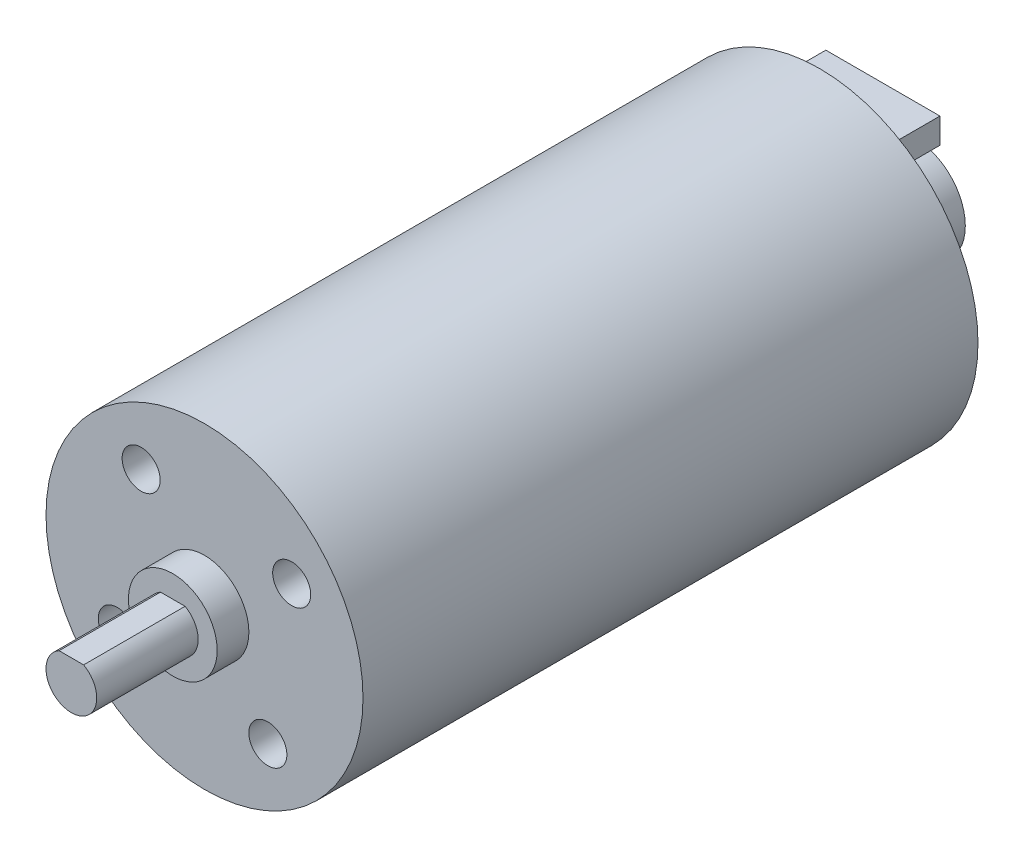
ISO-10303-21;
HEADER;
FILE_DESCRIPTION(('STEP AP214'),'2;1');
FILE_NAME('part.step','',(''),(''),'','','');
FILE_SCHEMA(('AUTOMOTIVE_DESIGN { 1 0 10303 214 1 1 1 1 }'));
ENDSEC;
DATA;
#1=APPLICATION_CONTEXT('core data for automotive mechanical design processes');
#2=APPLICATION_PROTOCOL_DEFINITION('international standard','automotive_design',2000,#1);
#3=PRODUCT_CONTEXT('',#1,'mechanical');
#4=PRODUCT('Part','Part','',(#3));
#5=PRODUCT_RELATED_PRODUCT_CATEGORY('part','',(#4));
#6=PRODUCT_DEFINITION_FORMATION('','',#4);
#7=PRODUCT_DEFINITION_CONTEXT('part definition',#1,'design');
#8=PRODUCT_DEFINITION('design','',#6,#7);
#9=PRODUCT_DEFINITION_SHAPE('','',#8);
#10=(LENGTH_UNIT() NAMED_UNIT(*) SI_UNIT(.MILLI.,.METRE.));
#11=(NAMED_UNIT(*) PLANE_ANGLE_UNIT() SI_UNIT($,.RADIAN.));
#12=(NAMED_UNIT(*) SI_UNIT($,.STERADIAN.) SOLID_ANGLE_UNIT());
#13=UNCERTAINTY_MEASURE_WITH_UNIT(LENGTH_MEASURE(1.E-05),#10,'distance_accuracy_value','');
#14=(GEOMETRIC_REPRESENTATION_CONTEXT(3) GLOBAL_UNCERTAINTY_ASSIGNED_CONTEXT((#13)) GLOBAL_UNIT_ASSIGNED_CONTEXT((#10,
#11,#12)) REPRESENTATION_CONTEXT('',''));
#15=CARTESIAN_POINT('',(0.,0.,0.));
#16=DIRECTION('',(0.,0.,1.));
#17=DIRECTION('',(1.,0.,0.));
#18=AXIS2_PLACEMENT_3D('',#15,#16,#17);
#19=CARTESIAN_POINT('',(0.,0.,0.));
#20=DIRECTION('',(0.,0.,1.));
#21=DIRECTION('',(1.,0.,0.));
#22=AXIS2_PLACEMENT_3D('',#19,#20,#21);
#23=PLANE('',#22);
#24=DIRECTION('',(0.,1.,0.));
#25=VECTOR('',#24,1.);
#26=CARTESIAN_POINT('',(-4.5,-7.,0.));
#27=LINE('',#26,#25);
#28=CARTESIAN_POINT('',(-4.5,-9.,0.));
#29=VERTEX_POINT('',#28);
#30=CARTESIAN_POINT('',(-4.5,-7.,0.));
#31=VERTEX_POINT('',#30);
#32=EDGE_CURVE('E133',#29,#31,#27,.T.);
#33=ORIENTED_EDGE('',*,*,#32,.F.);
#34=DIRECTION('',(-1.,0.,0.));
#35=VECTOR('',#34,1.);
#36=CARTESIAN_POINT('',(-4.5,-9.,0.));
#37=LINE('',#36,#35);
#38=CARTESIAN_POINT('',(4.5,-9.,0.));
#39=VERTEX_POINT('',#38);
#40=EDGE_CURVE('E146',#39,#29,#37,.T.);
#41=ORIENTED_EDGE('',*,*,#40,.F.);
#42=DIRECTION('',(0.,-1.,0.));
#43=VECTOR('',#42,1.);
#44=CARTESIAN_POINT('',(4.5,-7.,0.));
#45=LINE('',#44,#43);
#46=CARTESIAN_POINT('',(4.5,-7.,0.));
#47=VERTEX_POINT('',#46);
#48=EDGE_CURVE('E155',#47,#39,#45,.T.);
#49=ORIENTED_EDGE('',*,*,#48,.F.);
#50=DIRECTION('',(1.,0.,0.));
#51=VECTOR('',#50,1.);
#52=CARTESIAN_POINT('',(-4.5,-7.,0.));
#53=LINE('',#52,#51);
#54=EDGE_CURVE('E136',#31,#47,#53,.T.);
#55=ORIENTED_EDGE('',*,*,#54,.F.);
#56=EDGE_LOOP('',(#33,#41,#49,#55));
#57=FACE_BOUND('',#56,.T.);
#58=CARTESIAN_POINT('',(0.,0.,0.));
#59=DIRECTION('',(0.,0.,1.));
#60=DIRECTION('',(1.,0.,0.));
#61=AXIS2_PLACEMENT_3D('',#58,#59,#60);
#62=CIRCLE('',#61,4.);
#63=CARTESIAN_POINT('',(4.,0.,0.));
#64=VERTEX_POINT('',#63);
#65=EDGE_CURVE('E11',#64,#64,#62,.F.);
#66=ORIENTED_EDGE('',*,*,#65,.F.);
#67=EDGE_LOOP('',(#66));
#68=FACE_BOUND('',#67,.T.);
#69=CARTESIAN_POINT('',(0.,0.,0.));
#70=DIRECTION('',(0.,0.,1.));
#71=DIRECTION('',(1.,0.,0.));
#72=AXIS2_PLACEMENT_3D('',#69,#70,#71);
#73=CIRCLE('',#72,12.5);
#74=CARTESIAN_POINT('',(-12.5,0.,0.));
#75=VERTEX_POINT('',#74);
#76=EDGE_CURVE('E217',#75,#75,#73,.T.);
#77=ORIENTED_EDGE('',*,*,#76,.F.);
#78=EDGE_LOOP('',(#77));
#79=FACE_BOUND('',#78,.T.);
#80=DIRECTION('',(0.,-1.,0.));
#81=VECTOR('',#80,1.);
#82=CARTESIAN_POINT('',(4.49999999999995,7.00000000000003,0.));
#83=LINE('',#82,#81);
#84=CARTESIAN_POINT('',(4.49999999999994,9.00000000000003,0.));
#85=VERTEX_POINT('',#84);
#86=CARTESIAN_POINT('',(4.49999999999995,7.00000000000003,0.));
#87=VERTEX_POINT('',#86);
#88=EDGE_CURVE('E132',#85,#87,#83,.T.);
#89=ORIENTED_EDGE('',*,*,#88,.F.);
#90=DIRECTION('',(1.,0.,0.));
#91=VECTOR('',#90,1.);
#92=CARTESIAN_POINT('',(4.49999999999994,9.00000000000003,0.));
#93=LINE('',#92,#91);
#94=CARTESIAN_POINT('',(-4.50000000000006,8.99999999999997,0.));
#95=VERTEX_POINT('',#94);
#96=EDGE_CURVE('E129',#95,#85,#93,.T.);
#97=ORIENTED_EDGE('',*,*,#96,.F.);
#98=DIRECTION('',(0.,1.,0.));
#99=VECTOR('',#98,1.);
#100=CARTESIAN_POINT('',(-4.50000000000005,6.99999999999997,0.));
#101=LINE('',#100,#99);
#102=CARTESIAN_POINT('',(-4.50000000000005,6.99999999999997,0.));
#103=VERTEX_POINT('',#102);
#104=EDGE_CURVE('E55',#103,#95,#101,.T.);
#105=ORIENTED_EDGE('',*,*,#104,.F.);
#106=DIRECTION('',(-1.,0.,0.));
#107=VECTOR('',#106,1.);
#108=CARTESIAN_POINT('',(4.49999999999995,7.00000000000003,0.));
#109=LINE('',#108,#107);
#110=EDGE_CURVE('E50',#87,#103,#109,.T.);
#111=ORIENTED_EDGE('',*,*,#110,.F.);
#112=EDGE_LOOP('',(#89,#97,#105,#111));
#113=FACE_BOUND('',#112,.T.);
#114=ADVANCED_FACE('F35',(#57,#68,#79,#113),#23,.F.);
#115=CARTESIAN_POINT('',(0.,0.,48.5));
#116=DIRECTION('',(0.,0.,-1.));
#117=DIRECTION('',(-1.,0.,0.));
#118=AXIS2_PLACEMENT_3D('',#115,#116,#117);
#119=CYLINDRICAL_SURFACE('',#118,12.5);
#120=CARTESIAN_POINT('',(0.,0.,48.5));
#121=DIRECTION('',(0.,0.,1.));
#122=DIRECTION('',(1.,0.,0.));
#123=AXIS2_PLACEMENT_3D('',#120,#121,#122);
#124=CIRCLE('',#123,12.5);
#125=CARTESIAN_POINT('',(-12.5,0.,48.5));
#126=VERTEX_POINT('',#125);
#127=EDGE_CURVE('E220',#126,#126,#124,.T.);
#128=CARTESIAN_POINT('',(-12.5,0.,48.5));
#129=CARTESIAN_POINT('',(-12.5,0.,47.9947916666667));
#130=CARTESIAN_POINT('',(-12.5,0.,47.4895833333333));
#131=CARTESIAN_POINT('',(-12.5,0.,46.4791666666667));
#132=CARTESIAN_POINT('',(-12.5,0.,45.9739583333333));
#133=CARTESIAN_POINT('',(-12.5,0.,44.9635416666667));
#134=CARTESIAN_POINT('',(-12.5,0.,44.4583333333333));
#135=CARTESIAN_POINT('',(-12.5,0.,43.4479166666667));
#136=CARTESIAN_POINT('',(-12.5,0.,42.9427083333333));
#137=CARTESIAN_POINT('',(-12.5,0.,41.9322916666667));
#138=CARTESIAN_POINT('',(-12.5,0.,41.4270833333333));
#139=CARTESIAN_POINT('',(-12.5,0.,40.4166666666667));
#140=CARTESIAN_POINT('',(-12.5,0.,39.9114583333333));
#141=CARTESIAN_POINT('',(-12.5,0.,38.9010416666667));
#142=CARTESIAN_POINT('',(-12.5,0.,38.3958333333333));
#143=CARTESIAN_POINT('',(-12.5,0.,37.3854166666667));
#144=CARTESIAN_POINT('',(-12.5,0.,36.8802083333333));
#145=CARTESIAN_POINT('',(-12.5,0.,35.8697916666667));
#146=CARTESIAN_POINT('',(-12.5,0.,35.3645833333333));
#147=CARTESIAN_POINT('',(-12.5,0.,34.3541666666667));
#148=CARTESIAN_POINT('',(-12.5,0.,33.8489583333333));
#149=CARTESIAN_POINT('',(-12.5,0.,32.8385416666667));
#150=CARTESIAN_POINT('',(-12.5,0.,32.3333333333333));
#151=CARTESIAN_POINT('',(-12.5,0.,31.3229166666667));
#152=CARTESIAN_POINT('',(-12.5,0.,30.8177083333333));
#153=CARTESIAN_POINT('',(-12.5,0.,29.8072916666667));
#154=CARTESIAN_POINT('',(-12.5,0.,29.3020833333333));
#155=CARTESIAN_POINT('',(-12.5,0.,28.2916666666667));
#156=CARTESIAN_POINT('',(-12.5,0.,27.7864583333333));
#157=CARTESIAN_POINT('',(-12.5,0.,26.7760416666667));
#158=CARTESIAN_POINT('',(-12.5,0.,26.2708333333333));
#159=CARTESIAN_POINT('',(-12.5,0.,25.2604166666667));
#160=CARTESIAN_POINT('',(-12.5,0.,24.7552083333333));
#161=CARTESIAN_POINT('',(-12.5,0.,23.7447916666667));
#162=CARTESIAN_POINT('',(-12.5,0.,23.2395833333333));
#163=CARTESIAN_POINT('',(-12.5,0.,22.2291666666667));
#164=CARTESIAN_POINT('',(-12.5,0.,21.7239583333333));
#165=CARTESIAN_POINT('',(-12.5,0.,20.7135416666667));
#166=CARTESIAN_POINT('',(-12.5,0.,20.2083333333333));
#167=CARTESIAN_POINT('',(-12.5,0.,19.1979166666667));
#168=CARTESIAN_POINT('',(-12.5,0.,18.6927083333333));
#169=CARTESIAN_POINT('',(-12.5,0.,17.6822916666667));
#170=CARTESIAN_POINT('',(-12.5,0.,17.1770833333333));
#171=CARTESIAN_POINT('',(-12.5,0.,16.1666666666667));
#172=CARTESIAN_POINT('',(-12.5,0.,15.6614583333333));
#173=CARTESIAN_POINT('',(-12.5,0.,14.6510416666667));
#174=CARTESIAN_POINT('',(-12.5,0.,14.1458333333333));
#175=CARTESIAN_POINT('',(-12.5,0.,13.1354166666667));
#176=CARTESIAN_POINT('',(-12.5,0.,12.6302083333333));
#177=CARTESIAN_POINT('',(-12.5,0.,11.6197916666667));
#178=CARTESIAN_POINT('',(-12.5,0.,11.1145833333333));
#179=CARTESIAN_POINT('',(-12.5,0.,10.1041666666667));
#180=CARTESIAN_POINT('',(-12.5,0.,9.59895833333333));
#181=CARTESIAN_POINT('',(-12.5,0.,8.58854166666666));
#182=CARTESIAN_POINT('',(-12.5,0.,8.08333333333333));
#183=CARTESIAN_POINT('',(-12.5,0.,7.07291666666666));
#184=CARTESIAN_POINT('',(-12.5,0.,6.56770833333333));
#185=CARTESIAN_POINT('',(-12.5,0.,5.55729166666666));
#186=CARTESIAN_POINT('',(-12.5,0.,5.05208333333333));
#187=CARTESIAN_POINT('',(-12.5,0.,4.04166666666666));
#188=CARTESIAN_POINT('',(-12.5,0.,3.53645833333333));
#189=CARTESIAN_POINT('',(-12.5,0.,2.52604166666666));
#190=CARTESIAN_POINT('',(-12.5,0.,2.02083333333333));
#191=CARTESIAN_POINT('',(-12.5,0.,1.01041666666666));
#192=CARTESIAN_POINT('',(-12.5,0.,0.505208333333326));
#193=CARTESIAN_POINT('',(-12.5,0.,0.));
#194=B_SPLINE_CURVE_WITH_KNOTS('',3,(#128,#129,#130,#131,#132,#133,#134,#135,#136,#137,#138,
#139,#140,#141,#142,#143,#144,#145,#146,#147,#148,#149,#150,#151,#152,#153,#154,#155,#156,#157,
#158,#159,#160,#161,#162,#163,#164,#165,#166,#167,#168,#169,#170,#171,#172,#173,#174,#175,#176,
#177,#178,#179,#180,#181,#182,#183,#184,#185,#186,#187,#188,#189,#190,#191,#192,#193),
.UNSPECIFIED.,.F.,.F.,(4,2,2,2,2,2,2,2,2,2,2,2,2,2,2,2,2,2,2,2,2,2,2,2,2,2,2,2,2,2,2,2,4),(0.,
1.51562500000001,3.03125000000001,4.54687500000001,6.06250000000001,7.57812500000001,
9.09375000000001,10.609375,12.125,13.640625,15.15625,16.671875,18.1875,19.703125,21.21875,
22.734375,24.25,25.765625,27.28125,28.796875,30.3125,31.828125,33.34375,34.859375,36.375,
37.890625,39.40625,40.921875,42.4375,43.953125,45.46875,46.984375,48.5),.UNSPECIFIED.);
#195=EDGE_CURVE('BSEAM37',#126,#75,#194,.T.);
#196=ORIENTED_EDGE('',*,*,#127,.F.);
#197=ORIENTED_EDGE('',*,*,#76,.T.);
#198=ORIENTED_EDGE('',*,*,#195,.T.);
#199=ORIENTED_EDGE('',*,*,#195,.F.);
#200=EDGE_LOOP('',(#196,#198,#197,#199));
#201=FACE_BOUND('',#200,.T.);
#202=ADVANCED_FACE('F37',(#201),#119,.T.);
#203=CARTESIAN_POINT('',(0.,0.,48.5));
#204=DIRECTION('',(0.,0.,1.));
#205=DIRECTION('',(1.,0.,0.));
#206=AXIS2_PLACEMENT_3D('',#203,#204,#205);
#207=PLANE('',#206);
#208=CARTESIAN_POINT('',(-6.87648111842054,-4.99639944640196,48.5));
#209=DIRECTION('',(0.,0.,1.));
#210=DIRECTION('',(1.,0.,0.));
#211=AXIS2_PLACEMENT_3D('',#208,#209,#210);
#212=CIRCLE('',#211,1.5);
#213=CARTESIAN_POINT('',(-5.37648111842054,-4.99639944640196,48.5));
#214=VERTEX_POINT('',#213);
#215=EDGE_CURVE('E179',#214,#214,#212,.T.);
#216=ORIENTED_EDGE('',*,*,#215,.F.);
#217=EDGE_LOOP('',(#216));
#218=FACE_BOUND('',#217,.T.);
#219=CARTESIAN_POINT('',(-4.99639944640193,6.87648111842056,48.5));
#220=DIRECTION('',(0.,0.,1.));
#221=DIRECTION('',(1.,0.,0.));
#222=AXIS2_PLACEMENT_3D('',#219,#220,#221);
#223=CIRCLE('',#222,1.5);
#224=CARTESIAN_POINT('',(-3.49639944640193,6.87648111842056,48.5));
#225=VERTEX_POINT('',#224);
#226=EDGE_CURVE('E185',#225,#225,#223,.T.);
#227=ORIENTED_EDGE('',*,*,#226,.F.);
#228=EDGE_LOOP('',(#227));
#229=FACE_BOUND('',#228,.T.);
#230=CARTESIAN_POINT('',(6.87648111842058,4.99639944640191,48.5));
#231=DIRECTION('',(0.,0.,1.));
#232=DIRECTION('',(1.,0.,0.));
#233=AXIS2_PLACEMENT_3D('',#230,#231,#232);
#234=CIRCLE('',#233,1.5);
#235=CARTESIAN_POINT('',(8.37648111842057,4.99639944640191,48.5));
#236=VERTEX_POINT('',#235);
#237=EDGE_CURVE('E174',#236,#236,#234,.T.);
#238=ORIENTED_EDGE('',*,*,#237,.F.);
#239=EDGE_LOOP('',(#238));
#240=FACE_BOUND('',#239,.T.);
#241=CARTESIAN_POINT('',(4.99639944640198,-6.87648111842052,48.5));
#242=DIRECTION('',(0.,0.,1.));
#243=DIRECTION('',(1.,0.,0.));
#244=AXIS2_PLACEMENT_3D('',#241,#242,#243);
#245=CIRCLE('',#244,1.5);
#246=CARTESIAN_POINT('',(6.49639944640198,-6.87648111842052,48.5));
#247=VERTEX_POINT('',#246);
#248=EDGE_CURVE('E178',#247,#247,#245,.T.);
#249=ORIENTED_EDGE('',*,*,#248,.F.);
#250=EDGE_LOOP('',(#249));
#251=FACE_BOUND('',#250,.T.);
#252=CARTESIAN_POINT('',(0.,0.,48.5));
#253=DIRECTION('',(0.,0.,1.));
#254=DIRECTION('',(1.,0.,0.));
#255=AXIS2_PLACEMENT_3D('',#252,#253,#254);
#256=CIRCLE('',#255,3.5);
#257=CARTESIAN_POINT('',(3.5,0.,48.5));
#258=VERTEX_POINT('',#257);
#259=EDGE_CURVE('E211',#258,#258,#256,.T.);
#260=ORIENTED_EDGE('',*,*,#259,.F.);
#261=EDGE_LOOP('',(#260));
#262=FACE_BOUND('',#261,.T.);
#263=ORIENTED_EDGE('',*,*,#127,.T.);
#264=EDGE_LOOP('',(#263));
#265=FACE_BOUND('',#264,.T.);
#266=ADVANCED_FACE('F248',(#218,#229,#240,#251,#262,#265),#207,.T.);
#267=CARTESIAN_POINT('',(0.,0.,51.));
#268=DIRECTION('',(0.,0.,-1.));
#269=DIRECTION('',(-1.,0.,0.));
#270=AXIS2_PLACEMENT_3D('',#267,#268,#269);
#271=CYLINDRICAL_SURFACE('',#270,3.5);
#272=CARTESIAN_POINT('',(0.,0.,51.));
#273=DIRECTION('',(0.,0.,1.));
#274=DIRECTION('',(1.,0.,0.));
#275=AXIS2_PLACEMENT_3D('',#272,#273,#274);
#276=CIRCLE('',#275,3.5);
#277=CARTESIAN_POINT('',(3.5,0.,51.));
#278=VERTEX_POINT('',#277);
#279=EDGE_CURVE('E214',#278,#278,#276,.T.);
#280=ORIENTED_EDGE('',*,*,#279,.F.);
#281=EDGE_LOOP('',(#280));
#282=FACE_BOUND('',#281,.T.);
#283=ORIENTED_EDGE('',*,*,#259,.T.);
#284=EDGE_LOOP('',(#283));
#285=FACE_BOUND('',#284,.T.);
#286=ADVANCED_FACE('F254',(#282,#285),#271,.T.);
#287=CARTESIAN_POINT('',(0.,0.,51.));
#288=DIRECTION('',(0.,0.,1.));
#289=DIRECTION('',(1.,0.,0.));
#290=AXIS2_PLACEMENT_3D('',#287,#288,#289);
#291=PLANE('',#290);
#292=ORIENTED_EDGE('',*,*,#279,.T.);
#293=EDGE_LOOP('',(#292));
#294=FACE_BOUND('',#293,.T.);
#295=CARTESIAN_POINT('',(0.,0.,51.));
#296=DIRECTION('',(0.,0.,1.));
#297=DIRECTION('',(1.,0.,0.));
#298=AXIS2_PLACEMENT_3D('',#295,#296,#297);
#299=CIRCLE('',#298,2.);
#300=CARTESIAN_POINT('',(-0.968512489243814,1.74985243897271,51.));
#301=VERTEX_POINT('',#300);
#302=CARTESIAN_POINT('',(0.968512489243813,1.74985243897271,51.));
#303=VERTEX_POINT('',#302);
#304=EDGE_CURVE('E207',#301,#303,#299,.T.);
#305=ORIENTED_EDGE('',*,*,#304,.F.);
#306=DIRECTION('',(1.,0.,0.));
#307=VECTOR('',#306,1.);
#308=CARTESIAN_POINT('',(-1.77092324910307,1.74985243897271,51.));
#309=LINE('',#308,#307);
#310=EDGE_CURVE('E196',#301,#303,#309,.T.);
#311=ORIENTED_EDGE('',*,*,#310,.T.);
#312=EDGE_LOOP('',(#305,#311));
#313=FACE_BOUND('',#312,.T.);
#314=ADVANCED_FACE('F241',(#294,#313),#291,.T.);
#315=CARTESIAN_POINT('',(0.,0.,59.));
#316=DIRECTION('',(0.,0.,-1.));
#317=DIRECTION('',(-1.,0.,0.));
#318=AXIS2_PLACEMENT_3D('',#315,#316,#317);
#319=CYLINDRICAL_SURFACE('',#318,2.);
#320=CARTESIAN_POINT('',(0.,0.,59.));
#321=DIRECTION('',(0.,0.,1.));
#322=DIRECTION('',(1.,0.,0.));
#323=AXIS2_PLACEMENT_3D('',#320,#321,#322);
#324=CIRCLE('',#323,2.);
#325=CARTESIAN_POINT('',(-0.968512489243813,1.74985243897271,59.));
#326=VERTEX_POINT('',#325);
#327=CARTESIAN_POINT('',(0.968512489243812,1.74985243897271,59.));
#328=VERTEX_POINT('',#327);
#329=EDGE_CURVE('E208',#326,#328,#324,.T.);
#330=ORIENTED_EDGE('',*,*,#329,.F.);
#331=DIRECTION('',(0.,0.,-1.));
#332=VECTOR('',#331,1.);
#333=CARTESIAN_POINT('',(-0.968512489243813,1.74985243897271,59.));
#334=LINE('',#333,#332);
#335=EDGE_CURVE('E204',#326,#301,#334,.T.);
#336=ORIENTED_EDGE('',*,*,#335,.T.);
#337=ORIENTED_EDGE('',*,*,#304,.T.);
#338=DIRECTION('',(0.,0.,-1.));
#339=VECTOR('',#338,1.);
#340=CARTESIAN_POINT('',(0.968512489243813,1.74985243897271,59.));
#341=LINE('',#340,#339);
#342=EDGE_CURVE('E201',#303,#328,#341,.F.);
#343=ORIENTED_EDGE('',*,*,#342,.T.);
#344=EDGE_LOOP('',(#330,#336,#337,#343));
#345=FACE_BOUND('',#344,.T.);
#346=ADVANCED_FACE('F230',(#345),#319,.T.);
#347=CARTESIAN_POINT('',(0.,0.,59.));
#348=DIRECTION('',(0.,0.,1.));
#349=DIRECTION('',(1.,0.,0.));
#350=AXIS2_PLACEMENT_3D('',#347,#348,#349);
#351=PLANE('',#350);
#352=DIRECTION('',(1.,0.,0.));
#353=VECTOR('',#352,1.);
#354=CARTESIAN_POINT('',(0.,1.74985243897271,59.));
#355=LINE('',#354,#353);
#356=EDGE_CURVE('E43',#326,#328,#355,.T.);
#357=ORIENTED_EDGE('',*,*,#356,.F.);
#358=ORIENTED_EDGE('',*,*,#329,.T.);
#359=EDGE_LOOP('',(#357,#358));
#360=FACE_BOUND('',#359,.T.);
#361=ADVANCED_FACE('F232',(#360),#351,.T.);
#362=CARTESIAN_POINT('',(-1.77092324910307,1.74985243897271,51.));
#363=DIRECTION('',(0.,-1.,0.));
#364=DIRECTION('',(1.,0.,0.));
#365=AXIS2_PLACEMENT_3D('',#362,#363,#364);
#366=PLANE('',#365);
#367=ORIENTED_EDGE('',*,*,#356,.T.);
#368=ORIENTED_EDGE('',*,*,#342,.F.);
#369=ORIENTED_EDGE('',*,*,#310,.F.);
#370=ORIENTED_EDGE('',*,*,#335,.F.);
#371=EDGE_LOOP('',(#367,#368,#369,#370));
#372=FACE_BOUND('',#371,.T.);
#373=ADVANCED_FACE('F226',(#372),#366,.F.);
#374=CARTESIAN_POINT('',(4.99639944640198,-6.87648111842052,40.5));
#375=DIRECTION('',(0.,0.,1.));
#376=DIRECTION('',(1.,0.,0.));
#377=AXIS2_PLACEMENT_3D('',#374,#375,#376);
#378=CYLINDRICAL_SURFACE('',#377,1.5);
#379=CARTESIAN_POINT('',(4.99639944640198,-6.87648111842052,40.5));
#380=DIRECTION('',(0.,0.,1.));
#381=DIRECTION('',(1.,0.,0.));
#382=AXIS2_PLACEMENT_3D('',#379,#380,#381);
#383=CIRCLE('',#382,1.5);
#384=CARTESIAN_POINT('',(6.49639944640198,-6.87648111842052,40.5));
#385=VERTEX_POINT('',#384);
#386=EDGE_CURVE('E193',#385,#385,#383,.T.);
#387=ORIENTED_EDGE('',*,*,#386,.F.);
#388=EDGE_LOOP('',(#387));
#389=FACE_BOUND('',#388,.T.);
#390=ORIENTED_EDGE('',*,*,#248,.T.);
#391=EDGE_LOOP('',(#390));
#392=FACE_BOUND('',#391,.T.);
#393=ADVANCED_FACE('F239',(#389,#392),#378,.F.);
#394=CARTESIAN_POINT('',(4.99639944640198,-6.87648111842052,40.5));
#395=DIRECTION('',(0.,0.,1.));
#396=DIRECTION('',(1.,0.,0.));
#397=AXIS2_PLACEMENT_3D('',#394,#395,#396);
#398=PLANE('',#397);
#399=ORIENTED_EDGE('',*,*,#386,.T.);
#400=EDGE_LOOP('',(#399));
#401=FACE_BOUND('',#400,.T.);
#402=ADVANCED_FACE('F351',(#401),#398,.T.);
#403=CARTESIAN_POINT('',(6.87648111842058,4.99639944640191,40.5));
#404=DIRECTION('',(0.,0.,1.));
#405=DIRECTION('',(1.,0.,0.));
#406=AXIS2_PLACEMENT_3D('',#403,#404,#405);
#407=CYLINDRICAL_SURFACE('',#406,1.5);
#408=CARTESIAN_POINT('',(6.87648111842058,4.99639944640191,40.5));
#409=DIRECTION('',(0.,0.,1.));
#410=DIRECTION('',(1.,0.,0.));
#411=AXIS2_PLACEMENT_3D('',#408,#409,#410);
#412=CIRCLE('',#411,1.5);
#413=CARTESIAN_POINT('',(8.37648111842057,4.99639944640191,40.5));
#414=VERTEX_POINT('',#413);
#415=EDGE_CURVE('E188',#414,#414,#412,.T.);
#416=ORIENTED_EDGE('',*,*,#415,.F.);
#417=EDGE_LOOP('',(#416));
#418=FACE_BOUND('',#417,.T.);
#419=ORIENTED_EDGE('',*,*,#237,.T.);
#420=EDGE_LOOP('',(#419));
#421=FACE_BOUND('',#420,.T.);
#422=ADVANCED_FACE('F347',(#418,#421),#407,.F.);
#423=CARTESIAN_POINT('',(6.87648111842058,4.99639944640191,40.5));
#424=DIRECTION('',(0.,0.,1.));
#425=DIRECTION('',(1.,0.,0.));
#426=AXIS2_PLACEMENT_3D('',#423,#424,#425);
#427=PLANE('',#426);
#428=ORIENTED_EDGE('',*,*,#415,.T.);
#429=EDGE_LOOP('',(#428));
#430=FACE_BOUND('',#429,.T.);
#431=ADVANCED_FACE('F343',(#430),#427,.T.);
#432=CARTESIAN_POINT('',(-4.99639944640193,6.87648111842056,40.5));
#433=DIRECTION('',(0.,0.,1.));
#434=DIRECTION('',(1.,0.,0.));
#435=AXIS2_PLACEMENT_3D('',#432,#433,#434);
#436=CYLINDRICAL_SURFACE('',#435,1.5);
#437=CARTESIAN_POINT('',(-4.99639944640193,6.87648111842056,40.5));
#438=DIRECTION('',(0.,0.,1.));
#439=DIRECTION('',(1.,0.,0.));
#440=AXIS2_PLACEMENT_3D('',#437,#438,#439);
#441=CIRCLE('',#440,1.5);
#442=CARTESIAN_POINT('',(-3.49639944640193,6.87648111842056,40.5));
#443=VERTEX_POINT('',#442);
#444=EDGE_CURVE('E182',#443,#443,#441,.T.);
#445=ORIENTED_EDGE('',*,*,#444,.F.);
#446=EDGE_LOOP('',(#445));
#447=FACE_BOUND('',#446,.T.);
#448=ORIENTED_EDGE('',*,*,#226,.T.);
#449=EDGE_LOOP('',(#448));
#450=FACE_BOUND('',#449,.T.);
#451=ADVANCED_FACE('F339',(#447,#450),#436,.F.);
#452=CARTESIAN_POINT('',(-4.99639944640193,6.87648111842056,40.5));
#453=DIRECTION('',(0.,0.,1.));
#454=DIRECTION('',(1.,0.,0.));
#455=AXIS2_PLACEMENT_3D('',#452,#453,#454);
#456=PLANE('',#455);
#457=ORIENTED_EDGE('',*,*,#444,.T.);
#458=EDGE_LOOP('',(#457));
#459=FACE_BOUND('',#458,.T.);
#460=ADVANCED_FACE('F335',(#459),#456,.T.);
#461=CARTESIAN_POINT('',(-6.87648111842054,-4.99639944640196,40.5));
#462=DIRECTION('',(0.,0.,1.));
#463=DIRECTION('',(1.,0.,0.));
#464=AXIS2_PLACEMENT_3D('',#461,#462,#463);
#465=CYLINDRICAL_SURFACE('',#464,1.5);
#466=CARTESIAN_POINT('',(-6.87648111842054,-4.99639944640196,40.5));
#467=DIRECTION('',(0.,0.,1.));
#468=DIRECTION('',(1.,0.,0.));
#469=AXIS2_PLACEMENT_3D('',#466,#467,#468);
#470=CIRCLE('',#469,1.5);
#471=CARTESIAN_POINT('',(-5.37648111842054,-4.99639944640196,40.5));
#472=VERTEX_POINT('',#471);
#473=EDGE_CURVE('E175',#472,#472,#470,.T.);
#474=ORIENTED_EDGE('',*,*,#473,.F.);
#475=EDGE_LOOP('',(#474));
#476=FACE_BOUND('',#475,.T.);
#477=ORIENTED_EDGE('',*,*,#215,.T.);
#478=EDGE_LOOP('',(#477));
#479=FACE_BOUND('',#478,.T.);
#480=ADVANCED_FACE('F331',(#476,#479),#465,.F.);
#481=CARTESIAN_POINT('',(-6.87648111842054,-4.99639944640196,40.5));
#482=DIRECTION('',(0.,0.,1.));
#483=DIRECTION('',(1.,0.,0.));
#484=AXIS2_PLACEMENT_3D('',#481,#482,#483);
#485=PLANE('',#484);
#486=ORIENTED_EDGE('',*,*,#473,.T.);
#487=EDGE_LOOP('',(#486));
#488=FACE_BOUND('',#487,.T.);
#489=ADVANCED_FACE('F327',(#488),#485,.T.);
#490=CARTESIAN_POINT('',(0.,0.,-7.5));
#491=DIRECTION('',(0.,0.,1.));
#492=DIRECTION('',(1.,0.,0.));
#493=AXIS2_PLACEMENT_3D('',#490,#491,#492);
#494=CYLINDRICAL_SURFACE('',#493,4.);
#495=CARTESIAN_POINT('',(0.,0.,-7.5));
#496=DIRECTION('',(0.,0.,-1.));
#497=DIRECTION('',(-1.,0.,0.));
#498=AXIS2_PLACEMENT_3D('',#495,#496,#497);
#499=CIRCLE('',#498,4.);
#500=CARTESIAN_POINT('',(-4.,0.,-7.5));
#501=VERTEX_POINT('',#500);
#502=EDGE_CURVE('E171',#501,#501,#499,.T.);
#503=ORIENTED_EDGE('',*,*,#502,.F.);
#504=EDGE_LOOP('',(#503));
#505=FACE_BOUND('',#504,.T.);
#506=ORIENTED_EDGE('',*,*,#65,.T.);
#507=EDGE_LOOP('',(#506));
#508=FACE_BOUND('',#507,.T.);
#509=ADVANCED_FACE('F323',(#505,#508),#494,.T.);
#510=CARTESIAN_POINT('',(0.,0.,-7.5));
#511=DIRECTION('',(0.,0.,-1.));
#512=DIRECTION('',(-1.,0.,0.));
#513=AXIS2_PLACEMENT_3D('',#510,#511,#512);
#514=PLANE('',#513);
#515=ORIENTED_EDGE('',*,*,#502,.T.);
#516=EDGE_LOOP('',(#515));
#517=FACE_BOUND('',#516,.T.);
#518=ADVANCED_FACE('F319',(#517),#514,.T.);
#519=CARTESIAN_POINT('',(-4.5,-7.,-5.));
#520=DIRECTION('',(1.,0.,0.));
#521=DIRECTION('',(0.,1.,0.));
#522=AXIS2_PLACEMENT_3D('',#519,#520,#521);
#523=PLANE('',#522);
#524=ORIENTED_EDGE('',*,*,#32,.T.);
#525=DIRECTION('',(0.,0.,1.));
#526=VECTOR('',#525,1.);
#527=CARTESIAN_POINT('',(-4.5,-7.,-5.));
#528=LINE('',#527,#526);
#529=CARTESIAN_POINT('',(-4.5,-7.,-5.));
#530=VERTEX_POINT('',#529);
#531=EDGE_CURVE('E168',#530,#31,#528,.T.);
#532=ORIENTED_EDGE('',*,*,#531,.F.);
#533=DIRECTION('',(0.,1.,0.));
#534=VECTOR('',#533,1.);
#535=CARTESIAN_POINT('',(-4.5,-7.,-5.));
#536=LINE('',#535,#534);
#537=CARTESIAN_POINT('',(-4.5,-9.,-5.));
#538=VERTEX_POINT('',#537);
#539=EDGE_CURVE('E142',#538,#530,#536,.T.);
#540=ORIENTED_EDGE('',*,*,#539,.F.);
#541=DIRECTION('',(0.,0.,1.));
#542=VECTOR('',#541,1.);
#543=CARTESIAN_POINT('',(-4.5,-9.,-5.));
#544=LINE('',#543,#542);
#545=EDGE_CURVE('E151',#538,#29,#544,.T.);
#546=ORIENTED_EDGE('',*,*,#545,.T.);
#547=EDGE_LOOP('',(#524,#532,#540,#546));
#548=FACE_BOUND('',#547,.T.);
#549=ADVANCED_FACE('F315',(#548),#523,.F.);
#550=CARTESIAN_POINT('',(-4.5,-7.,-5.));
#551=DIRECTION('',(0.,-1.,0.));
#552=DIRECTION('',(0.,0.,-1.));
#553=AXIS2_PLACEMENT_3D('',#550,#551,#552);
#554=PLANE('',#553);
#555=ORIENTED_EDGE('',*,*,#54,.T.);
#556=DIRECTION('',(0.,0.,1.));
#557=VECTOR('',#556,1.);
#558=CARTESIAN_POINT('',(4.5,-7.,-5.));
#559=LINE('',#558,#557);
#560=CARTESIAN_POINT('',(4.5,-7.,-5.));
#561=VERTEX_POINT('',#560);
#562=EDGE_CURVE('E165',#561,#47,#559,.T.);
#563=ORIENTED_EDGE('',*,*,#562,.F.);
#564=DIRECTION('',(1.,0.,0.));
#565=VECTOR('',#564,1.);
#566=CARTESIAN_POINT('',(-4.5,-7.,-5.));
#567=LINE('',#566,#565);
#568=EDGE_CURVE('E145',#530,#561,#567,.T.);
#569=ORIENTED_EDGE('',*,*,#568,.F.);
#570=ORIENTED_EDGE('',*,*,#531,.T.);
#571=EDGE_LOOP('',(#555,#563,#569,#570));
#572=FACE_BOUND('',#571,.T.);
#573=ADVANCED_FACE('F311',(#572),#554,.F.);
#574=CARTESIAN_POINT('',(4.5,-7.,-5.));
#575=DIRECTION('',(-1.,0.,0.));
#576=DIRECTION('',(0.,-1.,0.));
#577=AXIS2_PLACEMENT_3D('',#574,#575,#576);
#578=PLANE('',#577);
#579=ORIENTED_EDGE('',*,*,#48,.T.);
#580=DIRECTION('',(0.,0.,1.));
#581=VECTOR('',#580,1.);
#582=CARTESIAN_POINT('',(4.5,-9.,-5.));
#583=LINE('',#582,#581);
#584=CARTESIAN_POINT('',(4.5,-9.,-5.));
#585=VERTEX_POINT('',#584);
#586=EDGE_CURVE('E162',#585,#39,#583,.T.);
#587=ORIENTED_EDGE('',*,*,#586,.F.);
#588=DIRECTION('',(0.,-1.,0.));
#589=VECTOR('',#588,1.);
#590=CARTESIAN_POINT('',(4.5,-7.,-5.));
#591=LINE('',#590,#589);
#592=EDGE_CURVE('E148',#561,#585,#591,.T.);
#593=ORIENTED_EDGE('',*,*,#592,.F.);
#594=ORIENTED_EDGE('',*,*,#562,.T.);
#595=EDGE_LOOP('',(#579,#587,#593,#594));
#596=FACE_BOUND('',#595,.T.);
#597=ADVANCED_FACE('F307',(#596),#578,.F.);
#598=CARTESIAN_POINT('',(-4.5,-9.,-5.));
#599=DIRECTION('',(0.,1.,0.));
#600=DIRECTION('',(0.,0.,1.));
#601=AXIS2_PLACEMENT_3D('',#598,#599,#600);
#602=PLANE('',#601);
#603=ORIENTED_EDGE('',*,*,#40,.T.);
#604=ORIENTED_EDGE('',*,*,#545,.F.);
#605=DIRECTION('',(-1.,0.,0.));
#606=VECTOR('',#605,1.);
#607=CARTESIAN_POINT('',(-4.5,-9.,-5.));
#608=LINE('',#607,#606);
#609=EDGE_CURVE('E150',#585,#538,#608,.T.);
#610=ORIENTED_EDGE('',*,*,#609,.F.);
#611=ORIENTED_EDGE('',*,*,#586,.T.);
#612=EDGE_LOOP('',(#603,#604,#610,#611));
#613=FACE_BOUND('',#612,.T.);
#614=ADVANCED_FACE('F303',(#613),#602,.F.);
#615=CARTESIAN_POINT('',(0.,0.,-5.));
#616=DIRECTION('',(0.,0.,1.));
#617=DIRECTION('',(1.,0.,0.));
#618=AXIS2_PLACEMENT_3D('',#615,#616,#617);
#619=PLANE('',#618);
#620=ORIENTED_EDGE('',*,*,#539,.T.);
#621=ORIENTED_EDGE('',*,*,#568,.T.);
#622=ORIENTED_EDGE('',*,*,#592,.T.);
#623=ORIENTED_EDGE('',*,*,#609,.T.);
#624=EDGE_LOOP('',(#620,#621,#622,#623));
#625=FACE_BOUND('',#624,.T.);
#626=ADVANCED_FACE('F300',(#625),#619,.F.);
#627=CARTESIAN_POINT('',(4.49999999999995,7.00000000000003,-5.));
#628=DIRECTION('',(-1.,0.,0.));
#629=DIRECTION('',(0.,-1.,0.));
#630=AXIS2_PLACEMENT_3D('',#627,#628,#629);
#631=PLANE('',#630);
#632=ORIENTED_EDGE('',*,*,#88,.T.);
#633=DIRECTION('',(0.,0.,1.));
#634=VECTOR('',#633,1.);
#635=CARTESIAN_POINT('',(4.49999999999995,7.00000000000003,-5.));
#636=LINE('',#635,#634);
#637=CARTESIAN_POINT('',(4.49999999999995,7.00000000000003,-5.));
#638=VERTEX_POINT('',#637);
#639=EDGE_CURVE('E113',#638,#87,#636,.T.);
#640=ORIENTED_EDGE('',*,*,#639,.F.);
#641=DIRECTION('',(0.,-1.,0.));
#642=VECTOR('',#641,1.);
#643=CARTESIAN_POINT('',(4.49999999999995,7.00000000000003,-5.));
#644=LINE('',#643,#642);
#645=CARTESIAN_POINT('',(4.49999999999994,9.00000000000003,-5.));
#646=VERTEX_POINT('',#645);
#647=EDGE_CURVE('E120',#646,#638,#644,.T.);
#648=ORIENTED_EDGE('',*,*,#647,.F.);
#649=DIRECTION('',(0.,0.,1.));
#650=VECTOR('',#649,1.);
#651=CARTESIAN_POINT('',(4.49999999999994,9.00000000000003,-5.));
#652=LINE('',#651,#650);
#653=EDGE_CURVE('E278',#646,#85,#652,.T.);
#654=ORIENTED_EDGE('',*,*,#653,.T.);
#655=EDGE_LOOP('',(#632,#640,#648,#654));
#656=FACE_BOUND('',#655,.T.);
#657=ADVANCED_FACE('F131',(#656),#631,.F.);
#658=CARTESIAN_POINT('',(4.49999999999995,7.00000000000003,-5.));
#659=DIRECTION('',(0.,1.,0.));
#660=DIRECTION('',(-1.,0.,0.));
#661=AXIS2_PLACEMENT_3D('',#658,#659,#660);
#662=PLANE('',#661);
#663=ORIENTED_EDGE('',*,*,#110,.T.);
#664=DIRECTION('',(0.,0.,1.));
#665=VECTOR('',#664,1.);
#666=CARTESIAN_POINT('',(-4.50000000000005,6.99999999999997,-5.));
#667=LINE('',#666,#665);
#668=CARTESIAN_POINT('',(-4.50000000000005,6.99999999999997,-5.));
#669=VERTEX_POINT('',#668);
#670=EDGE_CURVE('E116',#669,#103,#667,.T.);
#671=ORIENTED_EDGE('',*,*,#670,.F.);
#672=DIRECTION('',(-1.,0.,0.));
#673=VECTOR('',#672,1.);
#674=CARTESIAN_POINT('',(4.49999999999995,7.00000000000003,-5.));
#675=LINE('',#674,#673);
#676=EDGE_CURVE('E109',#638,#669,#675,.T.);
#677=ORIENTED_EDGE('',*,*,#676,.F.);
#678=ORIENTED_EDGE('',*,*,#639,.T.);
#679=EDGE_LOOP('',(#663,#671,#677,#678));
#680=FACE_BOUND('',#679,.T.);
#681=ADVANCED_FACE('F111',(#680),#662,.F.);
#682=CARTESIAN_POINT('',(-4.50000000000005,6.99999999999997,-5.));
#683=DIRECTION('',(1.,0.,0.));
#684=DIRECTION('',(0.,1.,0.));
#685=AXIS2_PLACEMENT_3D('',#682,#683,#684);
#686=PLANE('',#685);
#687=ORIENTED_EDGE('',*,*,#104,.T.);
#688=DIRECTION('',(0.,0.,1.));
#689=VECTOR('',#688,1.);
#690=CARTESIAN_POINT('',(-4.50000000000006,8.99999999999997,-5.));
#691=LINE('',#690,#689);
#692=CARTESIAN_POINT('',(-4.50000000000006,8.99999999999997,-5.));
#693=VERTEX_POINT('',#692);
#694=EDGE_CURVE('E138',#693,#95,#691,.T.);
#695=ORIENTED_EDGE('',*,*,#694,.F.);
#696=DIRECTION('',(0.,1.,0.));
#697=VECTOR('',#696,1.);
#698=CARTESIAN_POINT('',(-4.50000000000005,6.99999999999997,-5.));
#699=LINE('',#698,#697);
#700=EDGE_CURVE('E119',#669,#693,#699,.T.);
#701=ORIENTED_EDGE('',*,*,#700,.F.);
#702=ORIENTED_EDGE('',*,*,#670,.T.);
#703=EDGE_LOOP('',(#687,#695,#701,#702));
#704=FACE_BOUND('',#703,.T.);
#705=ADVANCED_FACE('F287',(#704),#686,.F.);
#706=CARTESIAN_POINT('',(4.49999999999994,9.00000000000003,-5.));
#707=DIRECTION('',(0.,-1.,0.));
#708=DIRECTION('',(1.,0.,0.));
#709=AXIS2_PLACEMENT_3D('',#706,#707,#708);
#710=PLANE('',#709);
#711=ORIENTED_EDGE('',*,*,#96,.T.);
#712=ORIENTED_EDGE('',*,*,#653,.F.);
#713=DIRECTION('',(1.,0.,0.));
#714=VECTOR('',#713,1.);
#715=CARTESIAN_POINT('',(4.49999999999994,9.00000000000003,-5.));
#716=LINE('',#715,#714);
#717=EDGE_CURVE('E125',#693,#646,#716,.T.);
#718=ORIENTED_EDGE('',*,*,#717,.F.);
#719=ORIENTED_EDGE('',*,*,#694,.T.);
#720=EDGE_LOOP('',(#711,#712,#718,#719));
#721=FACE_BOUND('',#720,.T.);
#722=ADVANCED_FACE('F277',(#721),#710,.F.);
#723=CARTESIAN_POINT('',(0.,0.,-5.));
#724=DIRECTION('',(0.,0.,1.));
#725=DIRECTION('',(1.,0.,0.));
#726=AXIS2_PLACEMENT_3D('',#723,#724,#725);
#727=PLANE('',#726);
#728=ORIENTED_EDGE('',*,*,#647,.T.);
#729=ORIENTED_EDGE('',*,*,#676,.T.);
#730=ORIENTED_EDGE('',*,*,#700,.T.);
#731=ORIENTED_EDGE('',*,*,#717,.T.);
#732=EDGE_LOOP('',(#728,#729,#730,#731));
#733=FACE_BOUND('',#732,.T.);
#734=ADVANCED_FACE('F123',(#733),#727,.F.);
#735=CLOSED_SHELL('',(#114,#202,#266,#286,#314,#346,#361,#373,#393,#402,#422,#431,#451,#460,
#480,#489,#509,#518,#549,#573,#597,#614,#626,#657,#681,#705,#722,#734));
#736=MANIFOLD_SOLID_BREP('B2',#735);
#737=ADVANCED_BREP_SHAPE_REPRESENTATION('',(#18,#736),#14);
#738=SHAPE_DEFINITION_REPRESENTATION(#9,#737);
ENDSEC;
END-ISO-10303-21;
